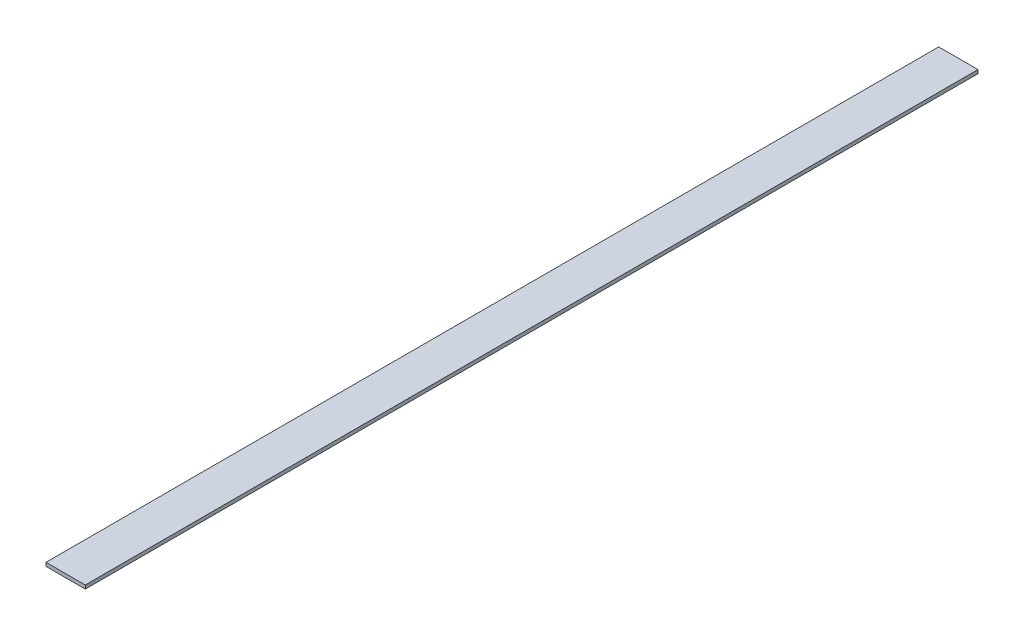
ISO-10303-21;
HEADER;
FILE_DESCRIPTION(('STEP AP214'),'2;1');
FILE_NAME('part.step','',(''),(''),'','','');
FILE_SCHEMA(('AUTOMOTIVE_DESIGN { 1 0 10303 214 1 1 1 1 }'));
ENDSEC;
DATA;
#1=APPLICATION_CONTEXT('core data for automotive mechanical design processes');
#2=APPLICATION_PROTOCOL_DEFINITION('international standard','automotive_design',2000,#1);
#3=PRODUCT_CONTEXT('',#1,'mechanical');
#4=PRODUCT('Part','Part','',(#3));
#5=PRODUCT_RELATED_PRODUCT_CATEGORY('part','',(#4));
#6=PRODUCT_DEFINITION_FORMATION('','',#4);
#7=PRODUCT_DEFINITION_CONTEXT('part definition',#1,'design');
#8=PRODUCT_DEFINITION('design','',#6,#7);
#9=PRODUCT_DEFINITION_SHAPE('','',#8);
#10=(LENGTH_UNIT() NAMED_UNIT(*) SI_UNIT(.MILLI.,.METRE.));
#11=(NAMED_UNIT(*) PLANE_ANGLE_UNIT() SI_UNIT($,.RADIAN.));
#12=(NAMED_UNIT(*) SI_UNIT($,.STERADIAN.) SOLID_ANGLE_UNIT());
#13=UNCERTAINTY_MEASURE_WITH_UNIT(LENGTH_MEASURE(1.E-05),#10,'distance_accuracy_value','');
#14=(GEOMETRIC_REPRESENTATION_CONTEXT(3) GLOBAL_UNCERTAINTY_ASSIGNED_CONTEXT((#13)) GLOBAL_UNIT_ASSIGNED_CONTEXT((#10,
#11,#12)) REPRESENTATION_CONTEXT('',''));
#15=CARTESIAN_POINT('',(0.,0.,0.));
#16=DIRECTION('',(0.,0.,1.));
#17=DIRECTION('',(1.,0.,0.));
#18=AXIS2_PLACEMENT_3D('',#15,#16,#17);
#19=CARTESIAN_POINT('',(0.,0.,2500.));
#20=DIRECTION('',(1.,0.,0.));
#21=DIRECTION('',(0.,0.,-1.));
#22=AXIS2_PLACEMENT_3D('',#19,#20,#21);
#23=PLANE('',#22);
#24=DIRECTION('',(0.,-1.,0.));
#25=VECTOR('',#24,1.);
#26=CARTESIAN_POINT('',(0.,0.,0.));
#27=LINE('',#26,#25);
#28=CARTESIAN_POINT('',(0.,0.,0.));
#29=VERTEX_POINT('',#28);
#30=CARTESIAN_POINT('',(0.,-10.,0.));
#31=VERTEX_POINT('',#30);
#32=EDGE_CURVE('E107',#29,#31,#27,.T.);
#33=ORIENTED_EDGE('',*,*,#32,.T.);
#34=DIRECTION('',(0.,0.,-1.));
#35=VECTOR('',#34,1.);
#36=CARTESIAN_POINT('',(0.,-10.,2500.));
#37=LINE('',#36,#35);
#38=CARTESIAN_POINT('',(0.,-10.,2500.));
#39=VERTEX_POINT('',#38);
#40=EDGE_CURVE('E11',#39,#31,#37,.T.);
#41=ORIENTED_EDGE('',*,*,#40,.F.);
#42=DIRECTION('',(0.,-1.,0.));
#43=VECTOR('',#42,1.);
#44=CARTESIAN_POINT('',(0.,0.,2500.));
#45=LINE('',#44,#43);
#46=CARTESIAN_POINT('',(0.,0.,2500.));
#47=VERTEX_POINT('',#46);
#48=EDGE_CURVE('E91',#47,#39,#45,.T.);
#49=ORIENTED_EDGE('',*,*,#48,.F.);
#50=DIRECTION('',(0.,0.,-1.));
#51=VECTOR('',#50,1.);
#52=CARTESIAN_POINT('',(0.,0.,2500.));
#53=LINE('',#52,#51);
#54=EDGE_CURVE('E103',#47,#29,#53,.T.);
#55=ORIENTED_EDGE('',*,*,#54,.T.);
#56=EDGE_LOOP('',(#33,#41,#49,#55));
#57=FACE_BOUND('',#56,.T.);
#58=ADVANCED_FACE('F39',(#57),#23,.F.);
#59=CARTESIAN_POINT('',(0.,-10.,2500.));
#60=DIRECTION('',(0.,1.,0.));
#61=DIRECTION('',(0.,0.,1.));
#62=AXIS2_PLACEMENT_3D('',#59,#60,#61);
#63=PLANE('',#62);
#64=DIRECTION('',(1.,0.,0.));
#65=VECTOR('',#64,1.);
#66=CARTESIAN_POINT('',(0.,-10.,0.));
#67=LINE('',#66,#65);
#68=CARTESIAN_POINT('',(110.,-10.,0.));
#69=VERTEX_POINT('',#68);
#70=EDGE_CURVE('E96',#31,#69,#67,.T.);
#71=ORIENTED_EDGE('',*,*,#70,.T.);
#72=DIRECTION('',(0.,0.,-1.));
#73=VECTOR('',#72,1.);
#74=CARTESIAN_POINT('',(110.,-10.,2500.));
#75=LINE('',#74,#73);
#76=CARTESIAN_POINT('',(110.,-10.,2500.));
#77=VERTEX_POINT('',#76);
#78=EDGE_CURVE('E48',#77,#69,#75,.T.);
#79=ORIENTED_EDGE('',*,*,#78,.F.);
#80=DIRECTION('',(1.,0.,0.));
#81=VECTOR('',#80,1.);
#82=CARTESIAN_POINT('',(0.,-10.,2500.));
#83=LINE('',#82,#81);
#84=EDGE_CURVE('E86',#39,#77,#83,.T.);
#85=ORIENTED_EDGE('',*,*,#84,.F.);
#86=ORIENTED_EDGE('',*,*,#40,.T.);
#87=EDGE_LOOP('',(#71,#79,#85,#86));
#88=FACE_BOUND('',#87,.T.);
#89=ADVANCED_FACE('F95',(#88),#63,.F.);
#90=CARTESIAN_POINT('',(110.,0.,2500.));
#91=DIRECTION('',(-1.,0.,0.));
#92=DIRECTION('',(0.,0.,1.));
#93=AXIS2_PLACEMENT_3D('',#90,#91,#92);
#94=PLANE('',#93);
#95=DIRECTION('',(0.,1.,0.));
#96=VECTOR('',#95,1.);
#97=CARTESIAN_POINT('',(110.,0.,0.));
#98=LINE('',#97,#96);
#99=CARTESIAN_POINT('',(110.,0.,0.));
#100=VERTEX_POINT('',#99);
#101=EDGE_CURVE('E73',#69,#100,#98,.T.);
#102=ORIENTED_EDGE('',*,*,#101,.T.);
#103=DIRECTION('',(0.,0.,-1.));
#104=VECTOR('',#103,1.);
#105=CARTESIAN_POINT('',(110.,0.,2500.));
#106=LINE('',#105,#104);
#107=CARTESIAN_POINT('',(110.,0.,2500.));
#108=VERTEX_POINT('',#107);
#109=EDGE_CURVE('E98',#108,#100,#106,.T.);
#110=ORIENTED_EDGE('',*,*,#109,.F.);
#111=DIRECTION('',(0.,1.,0.));
#112=VECTOR('',#111,1.);
#113=CARTESIAN_POINT('',(110.,0.,2500.));
#114=LINE('',#113,#112);
#115=EDGE_CURVE('E89',#77,#108,#114,.T.);
#116=ORIENTED_EDGE('',*,*,#115,.F.);
#117=ORIENTED_EDGE('',*,*,#78,.T.);
#118=EDGE_LOOP('',(#102,#110,#116,#117));
#119=FACE_BOUND('',#118,.T.);
#120=ADVANCED_FACE('F99',(#119),#94,.F.);
#121=CARTESIAN_POINT('',(0.,0.,2500.));
#122=DIRECTION('',(0.,-1.,0.));
#123=DIRECTION('',(0.,0.,-1.));
#124=AXIS2_PLACEMENT_3D('',#121,#122,#123);
#125=PLANE('',#124);
#126=DIRECTION('',(-1.,0.,0.));
#127=VECTOR('',#126,1.);
#128=CARTESIAN_POINT('',(0.,0.,0.));
#129=LINE('',#128,#127);
#130=EDGE_CURVE('E79',#100,#29,#129,.T.);
#131=ORIENTED_EDGE('',*,*,#130,.T.);
#132=ORIENTED_EDGE('',*,*,#54,.F.);
#133=DIRECTION('',(-1.,0.,0.));
#134=VECTOR('',#133,1.);
#135=CARTESIAN_POINT('',(0.,0.,2500.));
#136=LINE('',#135,#134);
#137=EDGE_CURVE('E56',#108,#47,#136,.T.);
#138=ORIENTED_EDGE('',*,*,#137,.F.);
#139=ORIENTED_EDGE('',*,*,#109,.T.);
#140=EDGE_LOOP('',(#131,#132,#138,#139));
#141=FACE_BOUND('',#140,.T.);
#142=ADVANCED_FACE('F120',(#141),#125,.F.);
#143=CARTESIAN_POINT('',(0.,0.,2500.));
#144=DIRECTION('',(0.,0.,1.));
#145=DIRECTION('',(1.,0.,0.));
#146=AXIS2_PLACEMENT_3D('',#143,#144,#145);
#147=PLANE('',#146);
#148=ORIENTED_EDGE('',*,*,#48,.T.);
#149=ORIENTED_EDGE('',*,*,#84,.T.);
#150=ORIENTED_EDGE('',*,*,#115,.T.);
#151=ORIENTED_EDGE('',*,*,#137,.T.);
#152=EDGE_LOOP('',(#148,#149,#150,#151));
#153=FACE_BOUND('',#152,.T.);
#154=ADVANCED_FACE('F87',(#153),#147,.T.);
#155=CARTESIAN_POINT('',(0.,0.,0.));
#156=DIRECTION('',(0.,0.,1.));
#157=DIRECTION('',(1.,0.,0.));
#158=AXIS2_PLACEMENT_3D('',#155,#156,#157);
#159=PLANE('',#158);
#160=ORIENTED_EDGE('',*,*,#32,.F.);
#161=ORIENTED_EDGE('',*,*,#130,.F.);
#162=ORIENTED_EDGE('',*,*,#101,.F.);
#163=ORIENTED_EDGE('',*,*,#70,.F.);
#164=EDGE_LOOP('',(#160,#161,#162,#163));
#165=FACE_BOUND('',#164,.T.);
#166=ADVANCED_FACE('F123',(#165),#159,.F.);
#167=CLOSED_SHELL('',(#58,#89,#120,#142,#154,#166));
#168=MANIFOLD_SOLID_BREP('B2',#167);
#169=ADVANCED_BREP_SHAPE_REPRESENTATION('',(#18,#168),#14);
#170=SHAPE_DEFINITION_REPRESENTATION(#9,#169);
ENDSEC;
END-ISO-10303-21;
